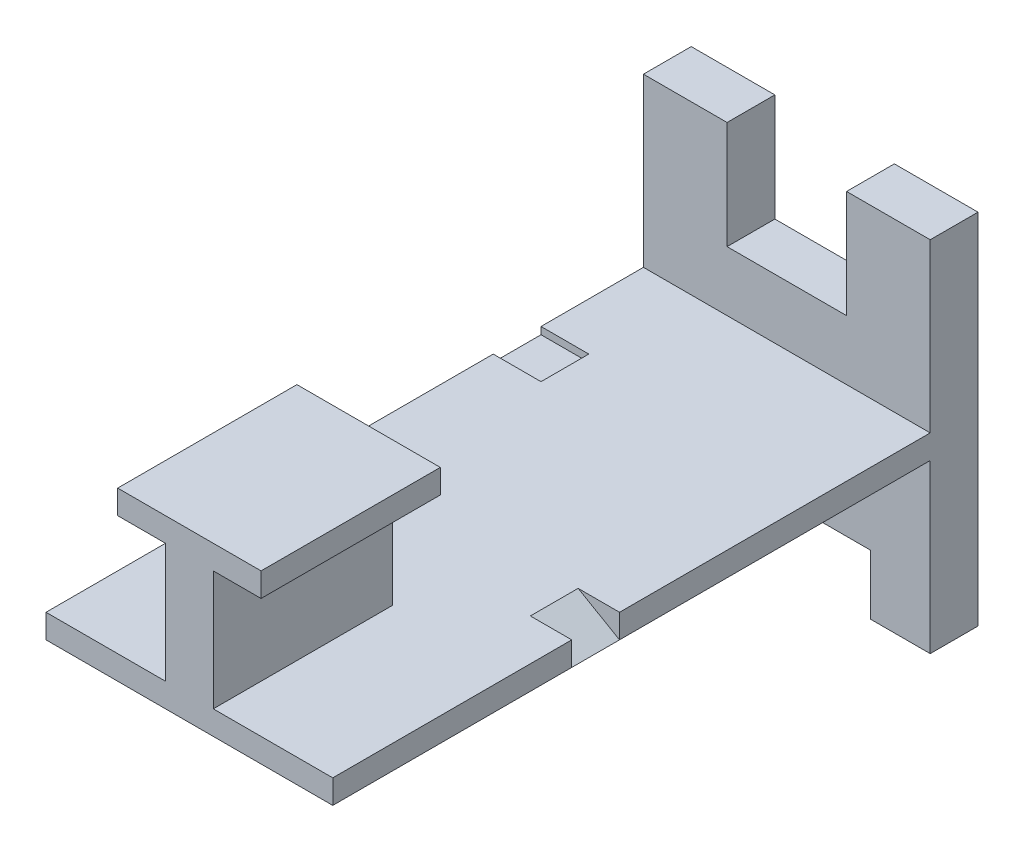
ISO-10303-21;
HEADER;
FILE_DESCRIPTION(('STEP AP214'),'2;1');
FILE_NAME('part.step','',(''),(''),'','','');
FILE_SCHEMA(('AUTOMOTIVE_DESIGN { 1 0 10303 214 1 1 1 1 }'));
ENDSEC;
DATA;
#1=APPLICATION_CONTEXT('core data for automotive mechanical design processes');
#2=APPLICATION_PROTOCOL_DEFINITION('international standard','automotive_design',2000,#1);
#3=PRODUCT_CONTEXT('',#1,'mechanical');
#4=PRODUCT('Part','Part','',(#3));
#5=PRODUCT_RELATED_PRODUCT_CATEGORY('part','',(#4));
#6=PRODUCT_DEFINITION_FORMATION('','',#4);
#7=PRODUCT_DEFINITION_CONTEXT('part definition',#1,'design');
#8=PRODUCT_DEFINITION('design','',#6,#7);
#9=PRODUCT_DEFINITION_SHAPE('','',#8);
#10=(LENGTH_UNIT() NAMED_UNIT(*) SI_UNIT(.MILLI.,.METRE.));
#11=(NAMED_UNIT(*) PLANE_ANGLE_UNIT() SI_UNIT($,.RADIAN.));
#12=(NAMED_UNIT(*) SI_UNIT($,.STERADIAN.) SOLID_ANGLE_UNIT());
#13=UNCERTAINTY_MEASURE_WITH_UNIT(LENGTH_MEASURE(1.E-05),#10,'distance_accuracy_value','');
#14=(GEOMETRIC_REPRESENTATION_CONTEXT(3) GLOBAL_UNCERTAINTY_ASSIGNED_CONTEXT((#13)) GLOBAL_UNIT_ASSIGNED_CONTEXT((#10,
#11,#12)) REPRESENTATION_CONTEXT('',''));
#15=CARTESIAN_POINT('',(0.,0.,0.));
#16=DIRECTION('',(0.,0.,1.));
#17=DIRECTION('',(1.,0.,0.));
#18=AXIS2_PLACEMENT_3D('',#15,#16,#17);
#19=CARTESIAN_POINT('',(0.,-70.,270.));
#20=DIRECTION('',(0.,-1.,0.));
#21=DIRECTION('',(0.,0.,-1.));
#22=AXIS2_PLACEMENT_3D('',#19,#20,#21);
#23=PLANE('',#22);
#24=DIRECTION('',(0.,0.,1.));
#25=VECTOR('',#24,1.);
#26=CARTESIAN_POINT('',(50.,-70.,270.));
#27=LINE('',#26,#25);
#28=CARTESIAN_POINT('',(50.,-70.,195.));
#29=VERTEX_POINT('',#28);
#30=CARTESIAN_POINT('',(50.,-70.,270.));
#31=VERTEX_POINT('',#30);
#32=EDGE_CURVE('E48',#29,#31,#27,.T.);
#33=ORIENTED_EDGE('',*,*,#32,.F.);
#34=DIRECTION('',(-1.,0.,0.));
#35=VECTOR('',#34,1.);
#36=CARTESIAN_POINT('',(50.,-70.,195.));
#37=LINE('',#36,#35);
#38=CARTESIAN_POINT('',(70.,-70.,195.));
#39=VERTEX_POINT('',#38);
#40=EDGE_CURVE('E275',#39,#29,#37,.T.);
#41=ORIENTED_EDGE('',*,*,#40,.F.);
#42=DIRECTION('',(0.,0.,-1.));
#43=VECTOR('',#42,1.);
#44=CARTESIAN_POINT('',(70.,-70.,270.));
#45=LINE('',#44,#43);
#46=CARTESIAN_POINT('',(70.,-70.,270.));
#47=VERTEX_POINT('',#46);
#48=EDGE_CURVE('E265',#47,#39,#45,.T.);
#49=ORIENTED_EDGE('',*,*,#48,.F.);
#50=DIRECTION('',(-1.,0.,0.));
#51=VECTOR('',#50,1.);
#52=CARTESIAN_POINT('',(0.,-70.,270.));
#53=LINE('',#52,#51);
#54=CARTESIAN_POINT('',(120.,-70.,270.));
#55=VERTEX_POINT('',#54);
#56=EDGE_CURVE('E389',#55,#47,#53,.T.);
#57=ORIENTED_EDGE('',*,*,#56,.F.);
#58=DIRECTION('',(0.,0.,-1.));
#59=VECTOR('',#58,1.);
#60=CARTESIAN_POINT('',(120.,-70.,270.));
#61=LINE('',#60,#59);
#62=CARTESIAN_POINT('',(120.,-70.,170.));
#63=VERTEX_POINT('',#62);
#64=EDGE_CURVE('E404',#55,#63,#61,.T.);
#65=ORIENTED_EDGE('',*,*,#64,.T.);
#66=DIRECTION('',(1.,0.,0.));
#67=VECTOR('',#66,1.);
#68=CARTESIAN_POINT('',(102.679491924311,-70.,170.));
#69=LINE('',#68,#67);
#70=CARTESIAN_POINT('',(102.679491924311,-70.,170.));
#71=VERTEX_POINT('',#70);
#72=EDGE_CURVE('E289',#71,#63,#69,.T.);
#73=ORIENTED_EDGE('',*,*,#72,.F.);
#74=DIRECTION('',(0.,0.,1.));
#75=VECTOR('',#74,1.);
#76=CARTESIAN_POINT('',(102.679491924311,-70.,150.));
#77=LINE('',#76,#75);
#78=CARTESIAN_POINT('',(102.679491924311,-70.,150.));
#79=VERTEX_POINT('',#78);
#80=EDGE_CURVE('E298',#79,#71,#77,.T.);
#81=ORIENTED_EDGE('',*,*,#80,.F.);
#82=DIRECTION('',(1.,0.,0.));
#83=VECTOR('',#82,1.);
#84=CARTESIAN_POINT('',(102.679491924311,-70.,150.));
#85=LINE('',#84,#83);
#86=CARTESIAN_POINT('',(120.,-70.,150.));
#87=VERTEX_POINT('',#86);
#88=EDGE_CURVE('E290',#79,#87,#85,.T.);
#89=ORIENTED_EDGE('',*,*,#88,.T.);
#90=CARTESIAN_POINT('',(120.,-70.,20.));
#91=VERTEX_POINT('',#90);
#92=EDGE_CURVE('E398',#87,#91,#61,.T.);
#93=ORIENTED_EDGE('',*,*,#92,.T.);
#94=DIRECTION('',(-1.,0.,0.));
#95=VECTOR('',#94,1.);
#96=CARTESIAN_POINT('',(0.,-70.,20.));
#97=LINE('',#96,#95);
#98=CARTESIAN_POINT('',(0.,-70.,20.));
#99=VERTEX_POINT('',#98);
#100=EDGE_CURVE('E382',#91,#99,#97,.T.);
#101=ORIENTED_EDGE('',*,*,#100,.T.);
#102=DIRECTION('',(0.,0.,-1.));
#103=VECTOR('',#102,1.);
#104=CARTESIAN_POINT('',(0.,-70.,270.));
#105=LINE('',#104,#103);
#106=CARTESIAN_POINT('',(0.,-70.,62.8598852917476));
#107=VERTEX_POINT('',#106);
#108=EDGE_CURVE('E414',#107,#99,#105,.T.);
#109=ORIENTED_EDGE('',*,*,#108,.F.);
#110=DIRECTION('',(-1.,0.,0.));
#111=VECTOR('',#110,1.);
#112=CARTESIAN_POINT('',(0.,-70.,62.8598852917476));
#113=LINE('',#112,#111);
#114=CARTESIAN_POINT('',(20.,-70.,62.8598852917476));
#115=VERTEX_POINT('',#114);
#116=EDGE_CURVE('E312',#115,#107,#113,.T.);
#117=ORIENTED_EDGE('',*,*,#116,.F.);
#118=DIRECTION('',(0.,0.,-1.));
#119=VECTOR('',#118,1.);
#120=CARTESIAN_POINT('',(20.,-70.,62.8598852917476));
#121=LINE('',#120,#119);
#122=CARTESIAN_POINT('',(20.,-70.,82.8598852917476));
#123=VERTEX_POINT('',#122);
#124=EDGE_CURVE('E324',#123,#115,#121,.T.);
#125=ORIENTED_EDGE('',*,*,#124,.F.);
#126=DIRECTION('',(1.,0.,0.));
#127=VECTOR('',#126,1.);
#128=CARTESIAN_POINT('',(0.,-70.,82.8598852917476));
#129=LINE('',#128,#127);
#130=CARTESIAN_POINT('',(0.,-70.,82.8598852917476));
#131=VERTEX_POINT('',#130);
#132=EDGE_CURVE('E307',#131,#123,#129,.T.);
#133=ORIENTED_EDGE('',*,*,#132,.F.);
#134=CARTESIAN_POINT('',(0.,-70.,270.));
#135=VERTEX_POINT('',#134);
#136=EDGE_CURVE('E415',#135,#131,#105,.T.);
#137=ORIENTED_EDGE('',*,*,#136,.F.);
#138=EDGE_CURVE('E392',#31,#135,#53,.T.);
#139=ORIENTED_EDGE('',*,*,#138,.F.);
#140=EDGE_LOOP('',(#33,#41,#49,#57,#65,#73,#81,#89,#93,#101,#109,#117,#125,#133,#137,#139));
#141=FACE_BOUND('',#140,.T.);
#142=ADVANCED_FACE('F33',(#141),#23,.F.);
#143=CARTESIAN_POINT('',(120.,0.,20.));
#144=DIRECTION('',(-1.,0.,0.));
#145=DIRECTION('',(0.,-1.,0.));
#146=AXIS2_PLACEMENT_3D('',#143,#144,#145);
#147=PLANE('',#146);
#148=DIRECTION('',(0.,-1.,0.));
#149=VECTOR('',#148,1.);
#150=CARTESIAN_POINT('',(120.,-70.,170.));
#151=LINE('',#150,#149);
#152=CARTESIAN_POINT('',(120.,-79.9999999999999,170.));
#153=VERTEX_POINT('',#152);
#154=EDGE_CURVE('E300',#63,#153,#151,.T.);
#155=ORIENTED_EDGE('',*,*,#154,.F.);
#156=ORIENTED_EDGE('',*,*,#64,.F.);
#157=DIRECTION('',(0.,1.,0.));
#158=VECTOR('',#157,1.);
#159=CARTESIAN_POINT('',(120.,-70.,270.));
#160=LINE('',#159,#158);
#161=CARTESIAN_POINT('',(120.,-79.9999999999999,270.));
#162=VERTEX_POINT('',#161);
#163=EDGE_CURVE('E396',#162,#55,#160,.T.);
#164=ORIENTED_EDGE('',*,*,#163,.F.);
#165=DIRECTION('',(0.,0.,-1.));
#166=VECTOR('',#165,1.);
#167=CARTESIAN_POINT('',(120.,-79.9999999999999,270.));
#168=LINE('',#167,#166);
#169=EDGE_CURVE('E408',#162,#153,#168,.T.);
#170=ORIENTED_EDGE('',*,*,#169,.T.);
#171=EDGE_LOOP('',(#155,#156,#164,#170));
#172=FACE_BOUND('',#171,.T.);
#173=ADVANCED_FACE('F521',(#172),#147,.F.);
#174=CARTESIAN_POINT('',(0.,-150.,20.));
#175=DIRECTION('',(0.,1.,0.));
#176=DIRECTION('',(0.,0.,1.));
#177=AXIS2_PLACEMENT_3D('',#174,#175,#176);
#178=PLANE('',#177);
#179=DIRECTION('',(1.,0.,0.));
#180=VECTOR('',#179,1.);
#181=CARTESIAN_POINT('',(0.,-150.,0.));
#182=LINE('',#181,#180);
#183=CARTESIAN_POINT('',(0.,-150.,0.));
#184=VERTEX_POINT('',#183);
#185=CARTESIAN_POINT('',(25.,-150.,0.));
#186=VERTEX_POINT('',#185);
#187=EDGE_CURVE('E439',#184,#186,#182,.T.);
#188=ORIENTED_EDGE('',*,*,#187,.T.);
#189=DIRECTION('',(0.,0.,1.));
#190=VECTOR('',#189,1.);
#191=CARTESIAN_POINT('',(25.,-150.,0.));
#192=LINE('',#191,#190);
#193=CARTESIAN_POINT('',(25.,-150.,20.));
#194=VERTEX_POINT('',#193);
#195=EDGE_CURVE('E347',#186,#194,#192,.T.);
#196=ORIENTED_EDGE('',*,*,#195,.T.);
#197=DIRECTION('',(1.,0.,0.));
#198=VECTOR('',#197,1.);
#199=CARTESIAN_POINT('',(0.,-150.,20.));
#200=LINE('',#199,#198);
#201=CARTESIAN_POINT('',(0.,-150.,20.));
#202=VERTEX_POINT('',#201);
#203=EDGE_CURVE('E424',#202,#194,#200,.T.);
#204=ORIENTED_EDGE('',*,*,#203,.F.);
#205=DIRECTION('',(0.,0.,-1.));
#206=VECTOR('',#205,1.);
#207=CARTESIAN_POINT('',(0.,-150.,20.));
#208=LINE('',#207,#206);
#209=EDGE_CURVE('E11',#202,#184,#208,.T.);
#210=ORIENTED_EDGE('',*,*,#209,.T.);
#211=EDGE_LOOP('',(#188,#196,#204,#210));
#212=FACE_BOUND('',#211,.T.);
#213=ADVANCED_FACE('F502',(#212),#178,.F.);
#214=CARTESIAN_POINT('',(0.,0.,20.));
#215=DIRECTION('',(0.,-1.,0.));
#216=DIRECTION('',(0.,0.,-1.));
#217=AXIS2_PLACEMENT_3D('',#214,#215,#216);
#218=PLANE('',#217);
#219=DIRECTION('',(-1.,0.,0.));
#220=VECTOR('',#219,1.);
#221=CARTESIAN_POINT('',(0.,0.,20.));
#222=LINE('',#221,#220);
#223=CARTESIAN_POINT('',(35.,0.,20.));
#224=VERTEX_POINT('',#223);
#225=CARTESIAN_POINT('',(0.,0.,20.));
#226=VERTEX_POINT('',#225);
#227=EDGE_CURVE('E431',#224,#226,#222,.T.);
#228=ORIENTED_EDGE('',*,*,#227,.F.);
#229=DIRECTION('',(0.,0.,1.));
#230=VECTOR('',#229,1.);
#231=CARTESIAN_POINT('',(35.,0.,0.));
#232=LINE('',#231,#230);
#233=CARTESIAN_POINT('',(35.,0.,0.));
#234=VERTEX_POINT('',#233);
#235=EDGE_CURVE('E380',#234,#224,#232,.T.);
#236=ORIENTED_EDGE('',*,*,#235,.F.);
#237=DIRECTION('',(-1.,0.,0.));
#238=VECTOR('',#237,1.);
#239=CARTESIAN_POINT('',(0.,0.,0.));
#240=LINE('',#239,#238);
#241=CARTESIAN_POINT('',(0.,0.,0.));
#242=VERTEX_POINT('',#241);
#243=EDGE_CURVE('E444',#234,#242,#240,.T.);
#244=ORIENTED_EDGE('',*,*,#243,.T.);
#245=DIRECTION('',(0.,0.,-1.));
#246=VECTOR('',#245,1.);
#247=CARTESIAN_POINT('',(0.,0.,20.));
#248=LINE('',#247,#246);
#249=EDGE_CURVE('E435',#226,#242,#248,.T.);
#250=ORIENTED_EDGE('',*,*,#249,.F.);
#251=EDGE_LOOP('',(#228,#236,#244,#250));
#252=FACE_BOUND('',#251,.T.);
#253=ADVANCED_FACE('F523',(#252),#218,.F.);
#254=CARTESIAN_POINT('',(0.,0.,20.));
#255=DIRECTION('',(0.,0.,1.));
#256=DIRECTION('',(1.,0.,0.));
#257=AXIS2_PLACEMENT_3D('',#254,#255,#256);
#258=PLANE('',#257);
#259=DIRECTION('',(0.,-1.,0.));
#260=VECTOR('',#259,1.);
#261=CARTESIAN_POINT('',(35.,0.,20.));
#262=LINE('',#261,#260);
#263=CARTESIAN_POINT('',(35.,-45.,20.));
#264=VERTEX_POINT('',#263);
#265=EDGE_CURVE('E356',#224,#264,#262,.T.);
#266=ORIENTED_EDGE('',*,*,#265,.F.);
#267=ORIENTED_EDGE('',*,*,#227,.T.);
#268=DIRECTION('',(0.,-1.,0.));
#269=VECTOR('',#268,1.);
#270=CARTESIAN_POINT('',(0.,0.,20.));
#271=LINE('',#270,#269);
#272=EDGE_CURVE('E419',#226,#99,#271,.T.);
#273=ORIENTED_EDGE('',*,*,#272,.T.);
#274=ORIENTED_EDGE('',*,*,#100,.F.);
#275=DIRECTION('',(0.,1.,0.));
#276=VECTOR('',#275,1.);
#277=CARTESIAN_POINT('',(120.,0.,20.));
#278=LINE('',#277,#276);
#279=CARTESIAN_POINT('',(120.,0.,20.));
#280=VERTEX_POINT('',#279);
#281=EDGE_CURVE('E427',#91,#280,#278,.T.);
#282=ORIENTED_EDGE('',*,*,#281,.T.);
#283=CARTESIAN_POINT('',(85.,0.,20.));
#284=VERTEX_POINT('',#283);
#285=EDGE_CURVE('E432',#280,#284,#222,.T.);
#286=ORIENTED_EDGE('',*,*,#285,.T.);
#287=DIRECTION('',(0.,1.,0.));
#288=VECTOR('',#287,1.);
#289=CARTESIAN_POINT('',(85.,0.,20.));
#290=LINE('',#289,#288);
#291=CARTESIAN_POINT('',(85.,-45.,20.));
#292=VERTEX_POINT('',#291);
#293=EDGE_CURVE('E367',#292,#284,#290,.T.);
#294=ORIENTED_EDGE('',*,*,#293,.F.);
#295=DIRECTION('',(1.,0.,0.));
#296=VECTOR('',#295,1.);
#297=CARTESIAN_POINT('',(35.,-45.,20.));
#298=LINE('',#297,#296);
#299=EDGE_CURVE('E376',#264,#292,#298,.T.);
#300=ORIENTED_EDGE('',*,*,#299,.F.);
#301=EDGE_LOOP('',(#266,#267,#273,#274,#282,#286,#294,#300));
#302=FACE_BOUND('',#301,.T.);
#303=ADVANCED_FACE('F473',(#302),#258,.T.);
#304=CARTESIAN_POINT('',(0.,0.,20.));
#305=DIRECTION('',(1.,0.,0.));
#306=DIRECTION('',(0.,1.,0.));
#307=AXIS2_PLACEMENT_3D('',#304,#305,#306);
#308=PLANE('',#307);
#309=DIRECTION('',(0.,0.,1.));
#310=VECTOR('',#309,1.);
#311=CARTESIAN_POINT('',(0.,-73.,62.8598852917476));
#312=LINE('',#311,#310);
#313=CARTESIAN_POINT('',(0.,-73.,62.8598852917476));
#314=VERTEX_POINT('',#313);
#315=CARTESIAN_POINT('',(0.,-73.,82.8598852917476));
#316=VERTEX_POINT('',#315);
#317=EDGE_CURVE('E308',#314,#316,#312,.T.);
#318=ORIENTED_EDGE('',*,*,#317,.F.);
#319=DIRECTION('',(0.,1.,0.));
#320=VECTOR('',#319,1.);
#321=CARTESIAN_POINT('',(0.,-73.,62.8598852917476));
#322=LINE('',#321,#320);
#323=EDGE_CURVE('E328',#314,#107,#322,.T.);
#324=ORIENTED_EDGE('',*,*,#323,.T.);
#325=ORIENTED_EDGE('',*,*,#108,.T.);
#326=ORIENTED_EDGE('',*,*,#272,.F.);
#327=ORIENTED_EDGE('',*,*,#249,.T.);
#328=DIRECTION('',(0.,-1.,0.));
#329=VECTOR('',#328,1.);
#330=CARTESIAN_POINT('',(0.,0.,0.));
#331=LINE('',#330,#329);
#332=EDGE_CURVE('E418',#242,#184,#331,.T.);
#333=ORIENTED_EDGE('',*,*,#332,.T.);
#334=ORIENTED_EDGE('',*,*,#209,.F.);
#335=CARTESIAN_POINT('',(0.,-80.,20.));
#336=VERTEX_POINT('',#335);
#337=EDGE_CURVE('E423',#336,#202,#271,.T.);
#338=ORIENTED_EDGE('',*,*,#337,.F.);
#339=DIRECTION('',(0.,0.,-1.));
#340=VECTOR('',#339,1.);
#341=CARTESIAN_POINT('',(0.,-80.,270.));
#342=LINE('',#341,#340);
#343=CARTESIAN_POINT('',(0.,-80.,270.));
#344=VERTEX_POINT('',#343);
#345=EDGE_CURVE('E411',#344,#336,#342,.T.);
#346=ORIENTED_EDGE('',*,*,#345,.F.);
#347=DIRECTION('',(0.,-1.,0.));
#348=VECTOR('',#347,1.);
#349=CARTESIAN_POINT('',(0.,-80.,270.));
#350=LINE('',#349,#348);
#351=EDGE_CURVE('E391',#135,#344,#350,.T.);
#352=ORIENTED_EDGE('',*,*,#351,.F.);
#353=ORIENTED_EDGE('',*,*,#136,.T.);
#354=DIRECTION('',(0.,1.,0.));
#355=VECTOR('',#354,1.);
#356=CARTESIAN_POINT('',(0.,-73.,82.8598852917476));
#357=LINE('',#356,#355);
#358=EDGE_CURVE('E321',#316,#131,#357,.T.);
#359=ORIENTED_EDGE('',*,*,#358,.F.);
#360=EDGE_LOOP('',(#318,#324,#325,#326,#327,#333,#334,#338,#346,#352,#353,#359));
#361=FACE_BOUND('',#360,.T.);
#362=ADVANCED_FACE('F35',(#361),#308,.F.);
#363=CARTESIAN_POINT('',(95.,-150.,20.));
#364=VERTEX_POINT('',#363);
#365=CARTESIAN_POINT('',(120.,-150.,20.));
#366=VERTEX_POINT('',#365);
#367=EDGE_CURVE('E422',#364,#366,#200,.T.);
#368=ORIENTED_EDGE('',*,*,#367,.F.);
#369=DIRECTION('',(0.,0.,1.));
#370=VECTOR('',#369,1.);
#371=CARTESIAN_POINT('',(95.,-150.,0.));
#372=LINE('',#371,#370);
#373=CARTESIAN_POINT('',(95.,-150.,0.));
#374=VERTEX_POINT('',#373);
#375=EDGE_CURVE('E359',#374,#364,#372,.T.);
#376=ORIENTED_EDGE('',*,*,#375,.F.);
#377=CARTESIAN_POINT('',(120.,-150.,0.));
#378=VERTEX_POINT('',#377);
#379=EDGE_CURVE('E438',#374,#378,#182,.T.);
#380=ORIENTED_EDGE('',*,*,#379,.T.);
#381=DIRECTION('',(0.,0.,-1.));
#382=VECTOR('',#381,1.);
#383=CARTESIAN_POINT('',(120.,-150.,20.));
#384=LINE('',#383,#382);
#385=EDGE_CURVE('E41',#366,#378,#384,.T.);
#386=ORIENTED_EDGE('',*,*,#385,.F.);
#387=EDGE_LOOP('',(#368,#376,#380,#386));
#388=FACE_BOUND('',#387,.T.);
#389=ADVANCED_FACE('F514',(#388),#178,.F.);
#390=ORIENTED_EDGE('',*,*,#92,.F.);
#391=DIRECTION('',(0.,-1.,0.));
#392=VECTOR('',#391,1.);
#393=CARTESIAN_POINT('',(120.,-70.,150.));
#394=LINE('',#393,#392);
#395=CARTESIAN_POINT('',(120.,-79.9999999999999,150.));
#396=VERTEX_POINT('',#395);
#397=EDGE_CURVE('E293',#87,#396,#394,.T.);
#398=ORIENTED_EDGE('',*,*,#397,.T.);
#399=CARTESIAN_POINT('',(120.,-79.9999999999999,20.));
#400=VERTEX_POINT('',#399);
#401=EDGE_CURVE('E407',#396,#400,#168,.T.);
#402=ORIENTED_EDGE('',*,*,#401,.T.);
#403=EDGE_CURVE('E428',#366,#400,#278,.T.);
#404=ORIENTED_EDGE('',*,*,#403,.F.);
#405=ORIENTED_EDGE('',*,*,#385,.T.);
#406=DIRECTION('',(0.,1.,0.));
#407=VECTOR('',#406,1.);
#408=CARTESIAN_POINT('',(120.,0.,0.));
#409=LINE('',#408,#407);
#410=CARTESIAN_POINT('',(120.,0.,0.));
#411=VERTEX_POINT('',#410);
#412=EDGE_CURVE('E442',#378,#411,#409,.T.);
#413=ORIENTED_EDGE('',*,*,#412,.T.);
#414=DIRECTION('',(0.,0.,-1.));
#415=VECTOR('',#414,1.);
#416=CARTESIAN_POINT('',(120.,0.,20.));
#417=LINE('',#416,#415);
#418=EDGE_CURVE('E450',#280,#411,#417,.T.);
#419=ORIENTED_EDGE('',*,*,#418,.F.);
#420=ORIENTED_EDGE('',*,*,#281,.F.);
#421=EDGE_LOOP('',(#390,#398,#402,#404,#405,#413,#419,#420));
#422=FACE_BOUND('',#421,.T.);
#423=ADVANCED_FACE('F458',(#422),#147,.F.);
#424=CARTESIAN_POINT('',(85.,0.,0.));
#425=VERTEX_POINT('',#424);
#426=EDGE_CURVE('E445',#411,#425,#240,.T.);
#427=ORIENTED_EDGE('',*,*,#426,.T.);
#428=DIRECTION('',(0.,0.,1.));
#429=VECTOR('',#428,1.);
#430=CARTESIAN_POINT('',(85.,0.,0.));
#431=LINE('',#430,#429);
#432=EDGE_CURVE('E383',#425,#284,#431,.T.);
#433=ORIENTED_EDGE('',*,*,#432,.T.);
#434=ORIENTED_EDGE('',*,*,#285,.F.);
#435=ORIENTED_EDGE('',*,*,#418,.T.);
#436=EDGE_LOOP('',(#427,#433,#434,#435));
#437=FACE_BOUND('',#436,.T.);
#438=ADVANCED_FACE('F467',(#437),#218,.F.);
#439=DIRECTION('',(0.,-1.,0.));
#440=VECTOR('',#439,1.);
#441=CARTESIAN_POINT('',(25.,-150.,20.));
#442=LINE('',#441,#440);
#443=CARTESIAN_POINT('',(25.,-125.,20.));
#444=VERTEX_POINT('',#443);
#445=EDGE_CURVE('E331',#444,#194,#442,.T.);
#446=ORIENTED_EDGE('',*,*,#445,.F.);
#447=DIRECTION('',(-1.,0.,0.));
#448=VECTOR('',#447,1.);
#449=CARTESIAN_POINT('',(25.,-125.,20.));
#450=LINE('',#449,#448);
#451=CARTESIAN_POINT('',(95.,-125.,20.));
#452=VERTEX_POINT('',#451);
#453=EDGE_CURVE('E341',#452,#444,#450,.T.);
#454=ORIENTED_EDGE('',*,*,#453,.F.);
#455=DIRECTION('',(0.,1.,0.));
#456=VECTOR('',#455,1.);
#457=CARTESIAN_POINT('',(95.,-150.,20.));
#458=LINE('',#457,#456);
#459=EDGE_CURVE('E349',#364,#452,#458,.T.);
#460=ORIENTED_EDGE('',*,*,#459,.F.);
#461=ORIENTED_EDGE('',*,*,#367,.T.);
#462=ORIENTED_EDGE('',*,*,#403,.T.);
#463=DIRECTION('',(1.,0.,0.));
#464=VECTOR('',#463,1.);
#465=CARTESIAN_POINT('',(120.,-79.9999999999999,20.));
#466=LINE('',#465,#464);
#467=EDGE_CURVE('E401',#336,#400,#466,.T.);
#468=ORIENTED_EDGE('',*,*,#467,.F.);
#469=ORIENTED_EDGE('',*,*,#337,.T.);
#470=ORIENTED_EDGE('',*,*,#203,.T.);
#471=EDGE_LOOP('',(#446,#454,#460,#461,#462,#468,#469,#470));
#472=FACE_BOUND('',#471,.T.);
#473=ADVANCED_FACE('F494',(#472),#258,.T.);
#474=CARTESIAN_POINT('',(0.,0.,0.));
#475=DIRECTION('',(0.,0.,1.));
#476=DIRECTION('',(1.,0.,0.));
#477=AXIS2_PLACEMENT_3D('',#474,#475,#476);
#478=PLANE('',#477);
#479=DIRECTION('',(-1.,0.,0.));
#480=VECTOR('',#479,1.);
#481=CARTESIAN_POINT('',(25.,-125.,0.));
#482=LINE('',#481,#480);
#483=CARTESIAN_POINT('',(95.,-125.,0.));
#484=VERTEX_POINT('',#483);
#485=CARTESIAN_POINT('',(25.,-125.,0.));
#486=VERTEX_POINT('',#485);
#487=EDGE_CURVE('E344',#484,#486,#482,.T.);
#488=ORIENTED_EDGE('',*,*,#487,.T.);
#489=DIRECTION('',(0.,-1.,0.));
#490=VECTOR('',#489,1.);
#491=CARTESIAN_POINT('',(25.,-150.,0.));
#492=LINE('',#491,#490);
#493=EDGE_CURVE('E337',#486,#186,#492,.T.);
#494=ORIENTED_EDGE('',*,*,#493,.T.);
#495=ORIENTED_EDGE('',*,*,#187,.F.);
#496=ORIENTED_EDGE('',*,*,#332,.F.);
#497=ORIENTED_EDGE('',*,*,#243,.F.);
#498=DIRECTION('',(0.,-1.,0.));
#499=VECTOR('',#498,1.);
#500=CARTESIAN_POINT('',(35.,0.,0.));
#501=LINE('',#500,#499);
#502=CARTESIAN_POINT('',(35.,-45.,0.));
#503=VERTEX_POINT('',#502);
#504=EDGE_CURVE('E363',#234,#503,#501,.T.);
#505=ORIENTED_EDGE('',*,*,#504,.T.);
#506=DIRECTION('',(1.,0.,0.));
#507=VECTOR('',#506,1.);
#508=CARTESIAN_POINT('',(35.,-45.,0.));
#509=LINE('',#508,#507);
#510=CARTESIAN_POINT('',(85.,-45.,0.));
#511=VERTEX_POINT('',#510);
#512=EDGE_CURVE('E366',#503,#511,#509,.T.);
#513=ORIENTED_EDGE('',*,*,#512,.T.);
#514=DIRECTION('',(0.,1.,0.));
#515=VECTOR('',#514,1.);
#516=CARTESIAN_POINT('',(85.,0.,0.));
#517=LINE('',#516,#515);
#518=EDGE_CURVE('E370',#511,#425,#517,.T.);
#519=ORIENTED_EDGE('',*,*,#518,.T.);
#520=ORIENTED_EDGE('',*,*,#426,.F.);
#521=ORIENTED_EDGE('',*,*,#412,.F.);
#522=ORIENTED_EDGE('',*,*,#379,.F.);
#523=DIRECTION('',(0.,1.,0.));
#524=VECTOR('',#523,1.);
#525=CARTESIAN_POINT('',(95.,-150.,0.));
#526=LINE('',#525,#524);
#527=EDGE_CURVE('E340',#374,#484,#526,.T.);
#528=ORIENTED_EDGE('',*,*,#527,.T.);
#529=EDGE_LOOP('',(#488,#494,#495,#496,#497,#505,#513,#519,#520,#521,#522,#528));
#530=FACE_BOUND('',#529,.T.);
#531=ADVANCED_FACE('F465',(#530),#478,.F.);
#532=CARTESIAN_POINT('',(120.,-79.9999999999999,270.));
#533=DIRECTION('',(0.,1.,0.));
#534=DIRECTION('',(-1.,0.,0.));
#535=AXIS2_PLACEMENT_3D('',#532,#533,#534);
#536=PLANE('',#535);
#537=ORIENTED_EDGE('',*,*,#467,.T.);
#538=ORIENTED_EDGE('',*,*,#401,.F.);
#539=DIRECTION('',(0.,0.,1.));
#540=VECTOR('',#539,1.);
#541=CARTESIAN_POINT('',(120.,-79.9999999999999,150.));
#542=LINE('',#541,#540);
#543=EDGE_CURVE('E304',#396,#153,#542,.T.);
#544=ORIENTED_EDGE('',*,*,#543,.T.);
#545=ORIENTED_EDGE('',*,*,#169,.F.);
#546=DIRECTION('',(1.,0.,0.));
#547=VECTOR('',#546,1.);
#548=CARTESIAN_POINT('',(120.,-79.9999999999999,270.));
#549=LINE('',#548,#547);
#550=EDGE_CURVE('E394',#344,#162,#549,.T.);
#551=ORIENTED_EDGE('',*,*,#550,.F.);
#552=ORIENTED_EDGE('',*,*,#345,.T.);
#553=EDGE_LOOP('',(#537,#538,#544,#545,#551,#552));
#554=FACE_BOUND('',#553,.T.);
#555=ADVANCED_FACE('F487',(#554),#536,.F.);
#556=CARTESIAN_POINT('',(0.,0.,270.));
#557=DIRECTION('',(0.,0.,-1.));
#558=DIRECTION('',(-1.,0.,0.));
#559=AXIS2_PLACEMENT_3D('',#556,#557,#558);
#560=PLANE('',#559);
#561=ORIENTED_EDGE('',*,*,#56,.T.);
#562=DIRECTION('',(0.,-1.,0.));
#563=VECTOR('',#562,1.);
#564=CARTESIAN_POINT('',(70.,-20.,270.));
#565=LINE('',#564,#563);
#566=CARTESIAN_POINT('',(70.,-20.,270.));
#567=VERTEX_POINT('',#566);
#568=EDGE_CURVE('E285',#567,#47,#565,.T.);
#569=ORIENTED_EDGE('',*,*,#568,.F.);
#570=DIRECTION('',(1.,0.,0.));
#571=VECTOR('',#570,1.);
#572=CARTESIAN_POINT('',(30.,-20.,270.));
#573=LINE('',#572,#571);
#574=CARTESIAN_POINT('',(90.,-20.,270.));
#575=VERTEX_POINT('',#574);
#576=EDGE_CURVE('E595',#567,#575,#573,.T.);
#577=ORIENTED_EDGE('',*,*,#576,.T.);
#578=DIRECTION('',(0.,-1.,0.));
#579=VECTOR('',#578,1.);
#580=CARTESIAN_POINT('',(90.,-9.99999999999999,270.));
#581=LINE('',#580,#579);
#582=CARTESIAN_POINT('',(90.,-9.99999999999999,270.));
#583=VERTEX_POINT('',#582);
#584=EDGE_CURVE('E246',#583,#575,#581,.T.);
#585=ORIENTED_EDGE('',*,*,#584,.F.);
#586=DIRECTION('',(1.,0.,0.));
#587=VECTOR('',#586,1.);
#588=CARTESIAN_POINT('',(30.,-9.99999999999999,270.));
#589=LINE('',#588,#587);
#590=CARTESIAN_POINT('',(30.,-9.99999999999999,270.));
#591=VERTEX_POINT('',#590);
#592=EDGE_CURVE('E237',#591,#583,#589,.T.);
#593=ORIENTED_EDGE('',*,*,#592,.F.);
#594=DIRECTION('',(0.,-1.,0.));
#595=VECTOR('',#594,1.);
#596=CARTESIAN_POINT('',(30.,-9.99999999999999,270.));
#597=LINE('',#596,#595);
#598=CARTESIAN_POINT('',(30.,-20.,270.));
#599=VERTEX_POINT('',#598);
#600=EDGE_CURVE('E243',#591,#599,#597,.T.);
#601=ORIENTED_EDGE('',*,*,#600,.T.);
#602=CARTESIAN_POINT('',(50.,-20.,270.));
#603=VERTEX_POINT('',#602);
#604=EDGE_CURVE('E581',#599,#603,#573,.T.);
#605=ORIENTED_EDGE('',*,*,#604,.T.);
#606=DIRECTION('',(0.,-1.,0.));
#607=VECTOR('',#606,1.);
#608=CARTESIAN_POINT('',(50.,-20.,270.));
#609=LINE('',#608,#607);
#610=EDGE_CURVE('E287',#603,#31,#609,.T.);
#611=ORIENTED_EDGE('',*,*,#610,.T.);
#612=ORIENTED_EDGE('',*,*,#138,.T.);
#613=ORIENTED_EDGE('',*,*,#351,.T.);
#614=ORIENTED_EDGE('',*,*,#550,.T.);
#615=ORIENTED_EDGE('',*,*,#163,.T.);
#616=EDGE_LOOP('',(#561,#569,#577,#585,#593,#601,#605,#611,#612,#613,#614,#615));
#617=FACE_BOUND('',#616,.T.);
#618=ADVANCED_FACE('F240',(#617),#560,.F.);
#619=CARTESIAN_POINT('',(35.,0.,0.));
#620=DIRECTION('',(-1.,0.,0.));
#621=DIRECTION('',(0.,-1.,0.));
#622=AXIS2_PLACEMENT_3D('',#619,#620,#621);
#623=PLANE('',#622);
#624=ORIENTED_EDGE('',*,*,#265,.T.);
#625=DIRECTION('',(0.,0.,1.));
#626=VECTOR('',#625,1.);
#627=CARTESIAN_POINT('',(35.,-45.,0.));
#628=LINE('',#627,#626);
#629=EDGE_CURVE('E373',#503,#264,#628,.T.);
#630=ORIENTED_EDGE('',*,*,#629,.F.);
#631=ORIENTED_EDGE('',*,*,#504,.F.);
#632=ORIENTED_EDGE('',*,*,#235,.T.);
#633=EDGE_LOOP('',(#624,#630,#631,#632));
#634=FACE_BOUND('',#633,.T.);
#635=ADVANCED_FACE('F551',(#634),#623,.F.);
#636=CARTESIAN_POINT('',(85.,0.,0.));
#637=DIRECTION('',(1.,0.,0.));
#638=DIRECTION('',(0.,0.,-1.));
#639=AXIS2_PLACEMENT_3D('',#636,#637,#638);
#640=PLANE('',#639);
#641=ORIENTED_EDGE('',*,*,#293,.T.);
#642=ORIENTED_EDGE('',*,*,#432,.F.);
#643=ORIENTED_EDGE('',*,*,#518,.F.);
#644=DIRECTION('',(0.,0.,1.));
#645=VECTOR('',#644,1.);
#646=CARTESIAN_POINT('',(85.,-45.,0.));
#647=LINE('',#646,#645);
#648=EDGE_CURVE('E386',#511,#292,#647,.T.);
#649=ORIENTED_EDGE('',*,*,#648,.T.);
#650=EDGE_LOOP('',(#641,#642,#643,#649));
#651=FACE_BOUND('',#650,.T.);
#652=ADVANCED_FACE('F628',(#651),#640,.F.);
#653=CARTESIAN_POINT('',(35.,-45.,0.));
#654=DIRECTION('',(0.,-1.,0.));
#655=DIRECTION('',(0.,0.,-1.));
#656=AXIS2_PLACEMENT_3D('',#653,#654,#655);
#657=PLANE('',#656);
#658=ORIENTED_EDGE('',*,*,#299,.T.);
#659=ORIENTED_EDGE('',*,*,#648,.F.);
#660=ORIENTED_EDGE('',*,*,#512,.F.);
#661=ORIENTED_EDGE('',*,*,#629,.T.);
#662=EDGE_LOOP('',(#658,#659,#660,#661));
#663=FACE_BOUND('',#662,.T.);
#664=ADVANCED_FACE('F627',(#663),#657,.F.);
#665=CARTESIAN_POINT('',(25.,-150.,0.));
#666=DIRECTION('',(-1.,0.,0.));
#667=DIRECTION('',(0.,0.,1.));
#668=AXIS2_PLACEMENT_3D('',#665,#666,#667);
#669=PLANE('',#668);
#670=ORIENTED_EDGE('',*,*,#445,.T.);
#671=ORIENTED_EDGE('',*,*,#195,.F.);
#672=ORIENTED_EDGE('',*,*,#493,.F.);
#673=DIRECTION('',(0.,0.,1.));
#674=VECTOR('',#673,1.);
#675=CARTESIAN_POINT('',(25.,-125.,0.));
#676=LINE('',#675,#674);
#677=EDGE_CURVE('E354',#486,#444,#676,.T.);
#678=ORIENTED_EDGE('',*,*,#677,.T.);
#679=EDGE_LOOP('',(#670,#671,#672,#678));
#680=FACE_BOUND('',#679,.T.);
#681=ADVANCED_FACE('F506',(#680),#669,.F.);
#682=CARTESIAN_POINT('',(25.,-125.,0.));
#683=DIRECTION('',(0.,1.,0.));
#684=DIRECTION('',(0.,0.,1.));
#685=AXIS2_PLACEMENT_3D('',#682,#683,#684);
#686=PLANE('',#685);
#687=ORIENTED_EDGE('',*,*,#453,.T.);
#688=ORIENTED_EDGE('',*,*,#677,.F.);
#689=ORIENTED_EDGE('',*,*,#487,.F.);
#690=DIRECTION('',(0.,0.,1.));
#691=VECTOR('',#690,1.);
#692=CARTESIAN_POINT('',(95.,-125.,0.));
#693=LINE('',#692,#691);
#694=EDGE_CURVE('E357',#484,#452,#693,.T.);
#695=ORIENTED_EDGE('',*,*,#694,.T.);
#696=EDGE_LOOP('',(#687,#688,#689,#695));
#697=FACE_BOUND('',#696,.T.);
#698=ADVANCED_FACE('F509',(#697),#686,.F.);
#699=CARTESIAN_POINT('',(95.,-150.,0.));
#700=DIRECTION('',(1.,0.,0.));
#701=DIRECTION('',(0.,0.,-1.));
#702=AXIS2_PLACEMENT_3D('',#699,#700,#701);
#703=PLANE('',#702);
#704=ORIENTED_EDGE('',*,*,#459,.T.);
#705=ORIENTED_EDGE('',*,*,#694,.F.);
#706=ORIENTED_EDGE('',*,*,#527,.F.);
#707=ORIENTED_EDGE('',*,*,#375,.T.);
#708=EDGE_LOOP('',(#704,#705,#706,#707));
#709=FACE_BOUND('',#708,.T.);
#710=ADVANCED_FACE('F512',(#709),#703,.F.);
#711=CARTESIAN_POINT('',(0.,-73.,62.8598852917476));
#712=DIRECTION('',(0.,0.,-1.));
#713=DIRECTION('',(-1.,0.,0.));
#714=AXIS2_PLACEMENT_3D('',#711,#712,#713);
#715=PLANE('',#714);
#716=ORIENTED_EDGE('',*,*,#116,.T.);
#717=ORIENTED_EDGE('',*,*,#323,.F.);
#718=DIRECTION('',(-1.,0.,0.));
#719=VECTOR('',#718,1.);
#720=CARTESIAN_POINT('',(0.,-73.,62.8598852917476));
#721=LINE('',#720,#719);
#722=CARTESIAN_POINT('',(20.,-73.,62.8598852917476));
#723=VERTEX_POINT('',#722);
#724=EDGE_CURVE('E318',#723,#314,#721,.T.);
#725=ORIENTED_EDGE('',*,*,#724,.F.);
#726=DIRECTION('',(0.,1.,0.));
#727=VECTOR('',#726,1.);
#728=CARTESIAN_POINT('',(20.,-73.,62.8598852917476));
#729=LINE('',#728,#727);
#730=EDGE_CURVE('E332',#723,#115,#729,.T.);
#731=ORIENTED_EDGE('',*,*,#730,.T.);
#732=EDGE_LOOP('',(#716,#717,#725,#731));
#733=FACE_BOUND('',#732,.T.);
#734=ADVANCED_FACE('F556',(#733),#715,.F.);
#735=CARTESIAN_POINT('',(20.,-73.,62.8598852917476));
#736=DIRECTION('',(1.,0.,0.));
#737=DIRECTION('',(0.,0.,-1.));
#738=AXIS2_PLACEMENT_3D('',#735,#736,#737);
#739=PLANE('',#738);
#740=ORIENTED_EDGE('',*,*,#124,.T.);
#741=ORIENTED_EDGE('',*,*,#730,.F.);
#742=DIRECTION('',(0.,0.,-1.));
#743=VECTOR('',#742,1.);
#744=CARTESIAN_POINT('',(20.,-73.,62.8598852917476));
#745=LINE('',#744,#743);
#746=CARTESIAN_POINT('',(20.,-73.,82.8598852917476));
#747=VERTEX_POINT('',#746);
#748=EDGE_CURVE('E315',#747,#723,#745,.T.);
#749=ORIENTED_EDGE('',*,*,#748,.F.);
#750=DIRECTION('',(0.,1.,0.));
#751=VECTOR('',#750,1.);
#752=CARTESIAN_POINT('',(20.,-73.,82.8598852917476));
#753=LINE('',#752,#751);
#754=EDGE_CURVE('E334',#747,#123,#753,.T.);
#755=ORIENTED_EDGE('',*,*,#754,.T.);
#756=EDGE_LOOP('',(#740,#741,#749,#755));
#757=FACE_BOUND('',#756,.T.);
#758=ADVANCED_FACE('F561',(#757),#739,.F.);
#759=CARTESIAN_POINT('',(0.,-73.,82.8598852917476));
#760=DIRECTION('',(0.,0.,1.));
#761=DIRECTION('',(1.,0.,0.));
#762=AXIS2_PLACEMENT_3D('',#759,#760,#761);
#763=PLANE('',#762);
#764=ORIENTED_EDGE('',*,*,#132,.T.);
#765=ORIENTED_EDGE('',*,*,#754,.F.);
#766=DIRECTION('',(1.,0.,0.));
#767=VECTOR('',#766,1.);
#768=CARTESIAN_POINT('',(0.,-73.,82.8598852917476));
#769=LINE('',#768,#767);
#770=EDGE_CURVE('E311',#316,#747,#769,.T.);
#771=ORIENTED_EDGE('',*,*,#770,.F.);
#772=ORIENTED_EDGE('',*,*,#358,.T.);
#773=EDGE_LOOP('',(#764,#765,#771,#772));
#774=FACE_BOUND('',#773,.T.);
#775=ADVANCED_FACE('F611',(#774),#763,.F.);
#776=CARTESIAN_POINT('',(0.,-73.,0.));
#777=DIRECTION('',(0.,1.,0.));
#778=DIRECTION('',(0.,0.,1.));
#779=AXIS2_PLACEMENT_3D('',#776,#777,#778);
#780=PLANE('',#779);
#781=ORIENTED_EDGE('',*,*,#317,.T.);
#782=ORIENTED_EDGE('',*,*,#770,.T.);
#783=ORIENTED_EDGE('',*,*,#748,.T.);
#784=ORIENTED_EDGE('',*,*,#724,.T.);
#785=EDGE_LOOP('',(#781,#782,#783,#784));
#786=FACE_BOUND('',#785,.T.);
#787=ADVANCED_FACE('F558',(#786),#780,.T.);
#788=CARTESIAN_POINT('',(120.,-79.9999999999999,150.));
#789=DIRECTION('',(0.500000000000001,0.866025403784438,0.));
#790=DIRECTION('',(-0.866025403784438,0.500000000000001,0.));
#791=AXIS2_PLACEMENT_3D('',#788,#789,#790);
#792=PLANE('',#791);
#793=DIRECTION('',(-0.866025403784438,0.500000000000001,0.));
#794=VECTOR('',#793,1.);
#795=CARTESIAN_POINT('',(120.,-79.9999999999999,170.));
#796=LINE('',#795,#794);
#797=EDGE_CURVE('E56',#153,#71,#796,.T.);
#798=ORIENTED_EDGE('',*,*,#797,.F.);
#799=ORIENTED_EDGE('',*,*,#543,.F.);
#800=DIRECTION('',(-0.866025403784438,0.500000000000001,0.));
#801=VECTOR('',#800,1.);
#802=CARTESIAN_POINT('',(120.,-79.9999999999999,150.));
#803=LINE('',#802,#801);
#804=EDGE_CURVE('E296',#396,#79,#803,.T.);
#805=ORIENTED_EDGE('',*,*,#804,.T.);
#806=ORIENTED_EDGE('',*,*,#80,.T.);
#807=EDGE_LOOP('',(#798,#799,#805,#806));
#808=FACE_BOUND('',#807,.T.);
#809=ADVANCED_FACE('F603',(#808),#792,.T.);
#810=CARTESIAN_POINT('',(0.,0.,150.));
#811=DIRECTION('',(0.,0.,-1.));
#812=DIRECTION('',(-1.,0.,0.));
#813=AXIS2_PLACEMENT_3D('',#810,#811,#812);
#814=PLANE('',#813);
#815=ORIENTED_EDGE('',*,*,#88,.F.);
#816=ORIENTED_EDGE('',*,*,#804,.F.);
#817=ORIENTED_EDGE('',*,*,#397,.F.);
#818=EDGE_LOOP('',(#815,#816,#817));
#819=FACE_BOUND('',#818,.T.);
#820=ADVANCED_FACE('F484',(#819),#814,.F.);
#821=CARTESIAN_POINT('',(0.,0.,170.));
#822=DIRECTION('',(0.,0.,-1.));
#823=DIRECTION('',(-1.,0.,0.));
#824=AXIS2_PLACEMENT_3D('',#821,#822,#823);
#825=PLANE('',#824);
#826=ORIENTED_EDGE('',*,*,#72,.T.);
#827=ORIENTED_EDGE('',*,*,#154,.T.);
#828=ORIENTED_EDGE('',*,*,#797,.T.);
#829=EDGE_LOOP('',(#826,#827,#828));
#830=FACE_BOUND('',#829,.T.);
#831=ADVANCED_FACE('F602',(#830),#825,.T.);
#832=CARTESIAN_POINT('',(50.,-20.,270.));
#833=DIRECTION('',(1.,0.,0.));
#834=DIRECTION('',(0.,0.,-1.));
#835=AXIS2_PLACEMENT_3D('',#832,#833,#834);
#836=PLANE('',#835);
#837=ORIENTED_EDGE('',*,*,#32,.T.);
#838=ORIENTED_EDGE('',*,*,#610,.F.);
#839=DIRECTION('',(0.,0.,1.));
#840=VECTOR('',#839,1.);
#841=CARTESIAN_POINT('',(50.,-20.,270.));
#842=LINE('',#841,#840);
#843=CARTESIAN_POINT('',(50.,-20.,195.));
#844=VERTEX_POINT('',#843);
#845=EDGE_CURVE('E271',#844,#603,#842,.T.);
#846=ORIENTED_EDGE('',*,*,#845,.F.);
#847=DIRECTION('',(0.,-1.,0.));
#848=VECTOR('',#847,1.);
#849=CARTESIAN_POINT('',(50.,-20.,195.));
#850=LINE('',#849,#848);
#851=EDGE_CURVE('E277',#844,#29,#850,.T.);
#852=ORIENTED_EDGE('',*,*,#851,.T.);
#853=EDGE_LOOP('',(#837,#838,#846,#852));
#854=FACE_BOUND('',#853,.T.);
#855=ADVANCED_FACE('F574',(#854),#836,.F.);
#856=CARTESIAN_POINT('',(70.,-20.,270.));
#857=DIRECTION('',(-1.,0.,0.));
#858=DIRECTION('',(0.,0.,1.));
#859=AXIS2_PLACEMENT_3D('',#856,#857,#858);
#860=PLANE('',#859);
#861=ORIENTED_EDGE('',*,*,#48,.T.);
#862=DIRECTION('',(0.,-1.,0.));
#863=VECTOR('',#862,1.);
#864=CARTESIAN_POINT('',(70.,-20.,195.));
#865=LINE('',#864,#863);
#866=CARTESIAN_POINT('',(70.,-20.,195.));
#867=VERTEX_POINT('',#866);
#868=EDGE_CURVE('E282',#867,#39,#865,.T.);
#869=ORIENTED_EDGE('',*,*,#868,.F.);
#870=DIRECTION('',(0.,0.,-1.));
#871=VECTOR('',#870,1.);
#872=CARTESIAN_POINT('',(70.,-20.,270.));
#873=LINE('',#872,#871);
#874=EDGE_CURVE('E274',#567,#867,#873,.T.);
#875=ORIENTED_EDGE('',*,*,#874,.F.);
#876=ORIENTED_EDGE('',*,*,#568,.T.);
#877=EDGE_LOOP('',(#861,#869,#875,#876));
#878=FACE_BOUND('',#877,.T.);
#879=ADVANCED_FACE('F597',(#878),#860,.F.);
#880=CARTESIAN_POINT('',(50.,-20.,195.));
#881=DIRECTION('',(0.,0.,1.));
#882=DIRECTION('',(1.,0.,0.));
#883=AXIS2_PLACEMENT_3D('',#880,#881,#882);
#884=PLANE('',#883);
#885=ORIENTED_EDGE('',*,*,#40,.T.);
#886=ORIENTED_EDGE('',*,*,#851,.F.);
#887=DIRECTION('',(-1.,0.,0.));
#888=VECTOR('',#887,1.);
#889=CARTESIAN_POINT('',(30.,-20.,195.));
#890=LINE('',#889,#888);
#891=CARTESIAN_POINT('',(30.,-20.,195.));
#892=VERTEX_POINT('',#891);
#893=EDGE_CURVE('E577',#844,#892,#890,.T.);
#894=ORIENTED_EDGE('',*,*,#893,.T.);
#895=DIRECTION('',(0.,-1.,0.));
#896=VECTOR('',#895,1.);
#897=CARTESIAN_POINT('',(30.,-9.99999999999999,195.));
#898=LINE('',#897,#896);
#899=CARTESIAN_POINT('',(30.,-9.99999999999999,195.));
#900=VERTEX_POINT('',#899);
#901=EDGE_CURVE('E585',#900,#892,#898,.T.);
#902=ORIENTED_EDGE('',*,*,#901,.F.);
#903=DIRECTION('',(-1.,0.,0.));
#904=VECTOR('',#903,1.);
#905=CARTESIAN_POINT('',(30.,-9.99999999999999,195.));
#906=LINE('',#905,#904);
#907=CARTESIAN_POINT('',(90.,-9.99999999999999,195.));
#908=VERTEX_POINT('',#907);
#909=EDGE_CURVE('E255',#908,#900,#906,.T.);
#910=ORIENTED_EDGE('',*,*,#909,.F.);
#911=DIRECTION('',(0.,-1.,0.));
#912=VECTOR('',#911,1.);
#913=CARTESIAN_POINT('',(90.,-9.99999999999999,195.));
#914=LINE('',#913,#912);
#915=CARTESIAN_POINT('',(90.,-20.,195.));
#916=VERTEX_POINT('',#915);
#917=EDGE_CURVE('E267',#908,#916,#914,.T.);
#918=ORIENTED_EDGE('',*,*,#917,.T.);
#919=EDGE_CURVE('E259',#916,#867,#890,.T.);
#920=ORIENTED_EDGE('',*,*,#919,.T.);
#921=ORIENTED_EDGE('',*,*,#868,.T.);
#922=EDGE_LOOP('',(#885,#886,#894,#902,#910,#918,#920,#921));
#923=FACE_BOUND('',#922,.T.);
#924=ADVANCED_FACE('F571',(#923),#884,.F.);
#925=CARTESIAN_POINT('',(0.,-20.,0.));
#926=DIRECTION('',(0.,1.,0.));
#927=DIRECTION('',(0.,0.,1.));
#928=AXIS2_PLACEMENT_3D('',#925,#926,#927);
#929=PLANE('',#928);
#930=ORIENTED_EDGE('',*,*,#893,.F.);
#931=ORIENTED_EDGE('',*,*,#845,.T.);
#932=ORIENTED_EDGE('',*,*,#604,.F.);
#933=DIRECTION('',(0.,0.,1.));
#934=VECTOR('',#933,1.);
#935=CARTESIAN_POINT('',(30.,-20.,195.));
#936=LINE('',#935,#934);
#937=EDGE_CURVE('E263',#892,#599,#936,.T.);
#938=ORIENTED_EDGE('',*,*,#937,.F.);
#939=EDGE_LOOP('',(#930,#931,#932,#938));
#940=FACE_BOUND('',#939,.T.);
#941=ADVANCED_FACE('F578',(#940),#929,.F.);
#942=ORIENTED_EDGE('',*,*,#576,.F.);
#943=ORIENTED_EDGE('',*,*,#874,.T.);
#944=ORIENTED_EDGE('',*,*,#919,.F.);
#945=DIRECTION('',(0.,0.,-1.));
#946=VECTOR('',#945,1.);
#947=CARTESIAN_POINT('',(90.,-20.,195.));
#948=LINE('',#947,#946);
#949=EDGE_CURVE('E579',#575,#916,#948,.T.);
#950=ORIENTED_EDGE('',*,*,#949,.F.);
#951=EDGE_LOOP('',(#942,#943,#944,#950));
#952=FACE_BOUND('',#951,.T.);
#953=ADVANCED_FACE('F593',(#952),#929,.F.);
#954=CARTESIAN_POINT('',(30.,-9.99999999999999,195.));
#955=DIRECTION('',(1.,0.,0.));
#956=DIRECTION('',(0.,0.,-1.));
#957=AXIS2_PLACEMENT_3D('',#954,#955,#956);
#958=PLANE('',#957);
#959=ORIENTED_EDGE('',*,*,#937,.T.);
#960=ORIENTED_EDGE('',*,*,#600,.F.);
#961=DIRECTION('',(0.,0.,1.));
#962=VECTOR('',#961,1.);
#963=CARTESIAN_POINT('',(30.,-9.99999999999999,195.));
#964=LINE('',#963,#962);
#965=EDGE_CURVE('E250',#900,#591,#964,.T.);
#966=ORIENTED_EDGE('',*,*,#965,.F.);
#967=ORIENTED_EDGE('',*,*,#901,.T.);
#968=EDGE_LOOP('',(#959,#960,#966,#967));
#969=FACE_BOUND('',#968,.T.);
#970=ADVANCED_FACE('F261',(#969),#958,.F.);
#971=CARTESIAN_POINT('',(90.,-9.99999999999999,195.));
#972=DIRECTION('',(-1.,0.,0.));
#973=DIRECTION('',(0.,0.,1.));
#974=AXIS2_PLACEMENT_3D('',#971,#972,#973);
#975=PLANE('',#974);
#976=ORIENTED_EDGE('',*,*,#949,.T.);
#977=ORIENTED_EDGE('',*,*,#917,.F.);
#978=DIRECTION('',(0.,0.,-1.));
#979=VECTOR('',#978,1.);
#980=CARTESIAN_POINT('',(90.,-9.99999999999999,195.));
#981=LINE('',#980,#979);
#982=EDGE_CURVE('E249',#583,#908,#981,.T.);
#983=ORIENTED_EDGE('',*,*,#982,.F.);
#984=ORIENTED_EDGE('',*,*,#584,.T.);
#985=EDGE_LOOP('',(#976,#977,#983,#984));
#986=FACE_BOUND('',#985,.T.);
#987=ADVANCED_FACE('F828',(#986),#975,.F.);
#988=CARTESIAN_POINT('',(0.,-9.99999999999999,0.));
#989=DIRECTION('',(0.,1.,0.));
#990=DIRECTION('',(0.,0.,1.));
#991=AXIS2_PLACEMENT_3D('',#988,#989,#990);
#992=PLANE('',#991);
#993=ORIENTED_EDGE('',*,*,#965,.T.);
#994=ORIENTED_EDGE('',*,*,#592,.T.);
#995=ORIENTED_EDGE('',*,*,#982,.T.);
#996=ORIENTED_EDGE('',*,*,#909,.T.);
#997=EDGE_LOOP('',(#993,#994,#995,#996));
#998=FACE_BOUND('',#997,.T.);
#999=ADVANCED_FACE('F253',(#998),#992,.T.);
#1000=CLOSED_SHELL('',(#142,#173,#213,#253,#303,#362,#389,#423,#438,#473,#531,#555,#618,#635,
#652,#664,#681,#698,#710,#734,#758,#775,#787,#809,#820,#831,#855,#879,#924,#941,#953,#970,#987,#999));
#1001=MANIFOLD_SOLID_BREP('B2',#1000);
#1002=ADVANCED_BREP_SHAPE_REPRESENTATION('',(#18,#1001),#14);
#1003=SHAPE_DEFINITION_REPRESENTATION(#9,#1002);
ENDSEC;
END-ISO-10303-21;
